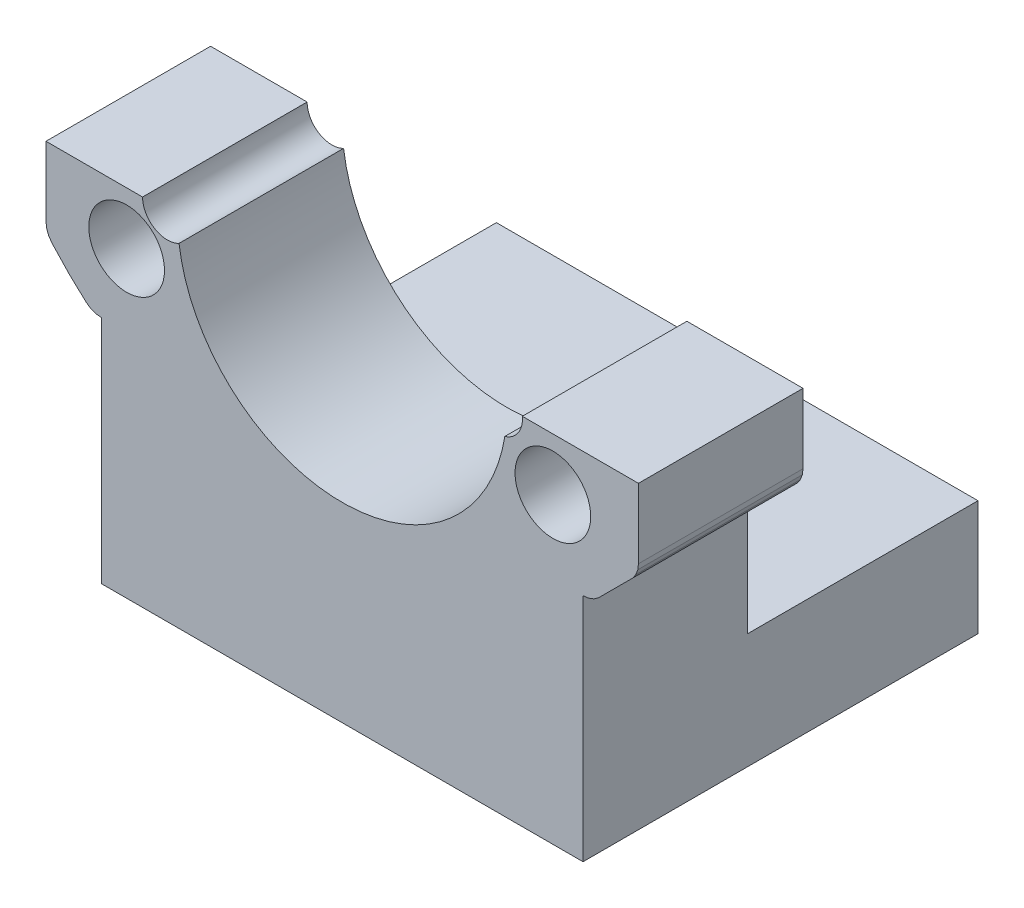
ISO-10303-21;
HEADER;
FILE_DESCRIPTION(('STEP AP214'),'2;1');
FILE_NAME('part.step','',(''),(''),'','','');
FILE_SCHEMA(('AUTOMOTIVE_DESIGN { 1 0 10303 214 1 1 1 1 }'));
ENDSEC;
DATA;
#1=APPLICATION_CONTEXT('core data for automotive mechanical design processes');
#2=APPLICATION_PROTOCOL_DEFINITION('international standard','automotive_design',2000,#1);
#3=PRODUCT_CONTEXT('',#1,'mechanical');
#4=PRODUCT('Part','Part','',(#3));
#5=PRODUCT_RELATED_PRODUCT_CATEGORY('part','',(#4));
#6=PRODUCT_DEFINITION_FORMATION('','',#4);
#7=PRODUCT_DEFINITION_CONTEXT('part definition',#1,'design');
#8=PRODUCT_DEFINITION('design','',#6,#7);
#9=PRODUCT_DEFINITION_SHAPE('','',#8);
#10=(LENGTH_UNIT() NAMED_UNIT(*) SI_UNIT(.MILLI.,.METRE.));
#11=(NAMED_UNIT(*) PLANE_ANGLE_UNIT() SI_UNIT($,.RADIAN.));
#12=(NAMED_UNIT(*) SI_UNIT($,.STERADIAN.) SOLID_ANGLE_UNIT());
#13=UNCERTAINTY_MEASURE_WITH_UNIT(LENGTH_MEASURE(1.E-05),#10,'distance_accuracy_value','');
#14=(GEOMETRIC_REPRESENTATION_CONTEXT(3) GLOBAL_UNCERTAINTY_ASSIGNED_CONTEXT((#13)) GLOBAL_UNIT_ASSIGNED_CONTEXT((#10,
#11,#12)) REPRESENTATION_CONTEXT('',''));
#15=CARTESIAN_POINT('',(0.,0.,0.));
#16=DIRECTION('',(0.,0.,1.));
#17=DIRECTION('',(1.,0.,0.));
#18=AXIS2_PLACEMENT_3D('',#15,#16,#17);
#19=CARTESIAN_POINT('',(189.181704305664,131.452042433818,-7.));
#20=DIRECTION('',(0.,-1.,0.));
#21=DIRECTION('',(0.,0.,-1.));
#22=AXIS2_PLACEMENT_3D('',#19,#20,#21);
#23=PLANE('',#22);
#24=DIRECTION('',(1.,0.,0.));
#25=VECTOR('',#24,1.);
#26=CARTESIAN_POINT('',(0.,131.452042433818,0.));
#27=LINE('',#26,#25);
#28=CARTESIAN_POINT('',(203.67064100923,131.452042433818,0.));
#29=VERTEX_POINT('',#28);
#30=CARTESIAN_POINT('',(207.199131389128,131.452042433818,0.));
#31=VERTEX_POINT('',#30);
#32=EDGE_CURVE('E239',#29,#31,#27,.T.);
#33=ORIENTED_EDGE('',*,*,#32,.F.);
#34=DIRECTION('',(0.,0.,1.));
#35=VECTOR('',#34,1.);
#36=CARTESIAN_POINT('',(203.67064100923,131.452042433818,-7.));
#37=LINE('',#36,#35);
#38=CARTESIAN_POINT('',(203.67064100923,131.452042433818,5.));
#39=VERTEX_POINT('',#38);
#40=EDGE_CURVE('E227',#29,#39,#37,.T.);
#41=ORIENTED_EDGE('',*,*,#40,.T.);
#42=DIRECTION('',(1.,0.,0.));
#43=VECTOR('',#42,1.);
#44=CARTESIAN_POINT('',(189.181704305664,131.452042433818,5.));
#45=LINE('',#44,#43);
#46=CARTESIAN_POINT('',(207.199131389128,131.452042433818,5.));
#47=VERTEX_POINT('',#46);
#48=EDGE_CURVE('E237',#39,#47,#45,.T.);
#49=ORIENTED_EDGE('',*,*,#48,.T.);
#50=DIRECTION('',(0.,0.,1.));
#51=VECTOR('',#50,1.);
#52=CARTESIAN_POINT('',(207.199131389128,131.452042433818,5.));
#53=LINE('',#52,#51);
#54=EDGE_CURVE('E268',#31,#47,#53,.T.);
#55=ORIENTED_EDGE('',*,*,#54,.F.);
#56=EDGE_LOOP('',(#33,#41,#49,#55));
#57=FACE_BOUND('',#56,.T.);
#58=ADVANCED_FACE('F47',(#57),#23,.F.);
#59=CARTESIAN_POINT('',(0.,0.,0.));
#60=DIRECTION('',(0.,0.,1.));
#61=DIRECTION('',(1.,0.,0.));
#62=AXIS2_PLACEMENT_3D('',#59,#60,#61);
#63=PLANE('',#62);
#64=CARTESIAN_POINT('',(191.649131389124,129.852042433818,0.));
#65=DIRECTION('',(0.,0.,1.));
#66=DIRECTION('',(1.,0.,0.));
#67=AXIS2_PLACEMENT_3D('',#64,#65,#66);
#68=CIRCLE('',#67,1.15000000000002);
#69=CARTESIAN_POINT('',(192.799131389124,129.852042433818,0.));
#70=VERTEX_POINT('',#69);
#71=EDGE_CURVE('E297',#70,#70,#68,.F.);
#72=ORIENTED_EDGE('',*,*,#71,.F.);
#73=EDGE_LOOP('',(#72));
#74=FACE_BOUND('',#73,.T.);
#75=CARTESIAN_POINT('',(204.599131389128,129.852042433818,0.));
#76=DIRECTION('',(0.,0.,1.));
#77=DIRECTION('',(1.,0.,0.));
#78=AXIS2_PLACEMENT_3D('',#75,#76,#77);
#79=CIRCLE('',#78,1.15000000000002);
#80=CARTESIAN_POINT('',(205.749131389128,129.852042433818,0.));
#81=VERTEX_POINT('',#80);
#82=EDGE_CURVE('E290',#81,#81,#79,.F.);
#83=ORIENTED_EDGE('',*,*,#82,.F.);
#84=EDGE_LOOP('',(#83));
#85=FACE_BOUND('',#84,.T.);
#86=CARTESIAN_POINT('',(189.199131389124,131.452042433818,0.));
#87=VERTEX_POINT('',#86);
#88=CARTESIAN_POINT('',(192.13252022332,131.452042433818,0.));
#89=VERTEX_POINT('',#88);
#90=EDGE_CURVE('E264',#87,#89,#27,.T.);
#91=ORIENTED_EDGE('',*,*,#90,.T.);
#92=CARTESIAN_POINT('',(192.886918709777,131.452042433818,0.));
#93=DIRECTION('',(0.,0.,1.));
#94=DIRECTION('',(1.,0.,0.));
#95=AXIS2_PLACEMENT_3D('',#92,#93,#94);
#96=CIRCLE('',#95,0.754398486457727);
#97=CARTESIAN_POINT('',(193.240054142263,130.785399768897,0.));
#98=VERTEX_POINT('',#97);
#99=EDGE_CURVE('E241',#89,#98,#96,.T.);
#100=ORIENTED_EDGE('',*,*,#99,.T.);
#101=CARTESIAN_POINT('',(198.199131389126,131.452042433818,0.));
#102=DIRECTION('',(0.,0.,1.));
#103=DIRECTION('',(1.,0.,0.));
#104=AXIS2_PLACEMENT_3D('',#101,#102,#103);
#105=CIRCLE('',#104,5.00368460067638);
#106=CARTESIAN_POINT('',(203.138984521825,130.655355161161,0.));
#107=VERTEX_POINT('',#106);
#108=EDGE_CURVE('E250',#98,#107,#105,.T.);
#109=ORIENTED_EDGE('',*,*,#108,.T.);
#110=CARTESIAN_POINT('',(202.919958347688,131.377258625214,0.));
#111=DIRECTION('',(0.,0.,1.));
#112=DIRECTION('',(1.,0.,0.));
#113=AXIS2_PLACEMENT_3D('',#110,#111,#112);
#114=CIRCLE('',#113,0.754398486457727);
#115=EDGE_CURVE('E70',#107,#29,#114,.T.);
#116=ORIENTED_EDGE('',*,*,#115,.T.);
#117=ORIENTED_EDGE('',*,*,#32,.T.);
#118=DIRECTION('',(3.00222328963253E-13,1.,0.));
#119=VECTOR('',#118,1.);
#120=CARTESIAN_POINT('',(207.199131389128,129.336090234141,0.));
#121=LINE('',#120,#119);
#122=CARTESIAN_POINT('',(207.199131389128,129.336090234141,0.));
#123=VERTEX_POINT('',#122);
#124=EDGE_CURVE('E422',#123,#31,#121,.T.);
#125=ORIENTED_EDGE('',*,*,#124,.F.);
#126=DIRECTION('',(0.120014541512522,0.992772133888507,0.));
#127=VECTOR('',#126,1.);
#128=CARTESIAN_POINT('',(207.178853849887,129.168352427967,0.));
#129=LINE('',#128,#127);
#130=CARTESIAN_POINT('',(207.178853849887,129.168352427967,0.));
#131=VERTEX_POINT('',#130);
#132=EDGE_CURVE('E419',#131,#123,#129,.T.);
#133=ORIENTED_EDGE('',*,*,#132,.F.);
#134=DIRECTION('',(0.354082694955069,0.935214117265857,0.));
#135=VECTOR('',#134,1.);
#136=CARTESIAN_POINT('',(207.118523910867,129.009007135276,0.));
#137=LINE('',#136,#135);
#138=CARTESIAN_POINT('',(207.118523910867,129.009007135276,0.));
#139=VERTEX_POINT('',#138);
#140=EDGE_CURVE('E416',#139,#131,#137,.T.);
#141=ORIENTED_EDGE('',*,*,#140,.F.);
#142=DIRECTION('',(0.567112335313196,0.823640455013966,0.));
#143=VECTOR('',#142,1.);
#144=CARTESIAN_POINT('',(207.023153735494,128.870497126327,0.));
#145=LINE('',#144,#143);
#146=CARTESIAN_POINT('',(207.023153735494,128.870497126327,0.));
#147=VERTEX_POINT('',#146);
#148=EDGE_CURVE('E413',#147,#139,#145,.T.);
#149=ORIENTED_EDGE('',*,*,#148,.F.);
#150=DIRECTION('',(0.707106781186924,0.707106781186171,0.));
#151=VECTOR('',#150,1.);
#152=CARTESIAN_POINT('',(205.981187619715,127.828531010549,0.));
#153=LINE('',#152,#151);
#154=CARTESIAN_POINT('',(205.981187619715,127.828531010549,0.));
#155=VERTEX_POINT('',#154);
#156=EDGE_CURVE('E410',#155,#147,#153,.T.);
#157=ORIENTED_EDGE('',*,*,#156,.F.);
#158=DIRECTION('',(0.824820147367993,0.565395193201925,0.));
#159=VECTOR('',#158,1.);
#160=CARTESIAN_POINT('',(205.840077690175,127.731803407411,0.));
#161=LINE('',#160,#159);
#162=CARTESIAN_POINT('',(205.840077690175,127.731803407411,0.));
#163=VERTEX_POINT('',#162);
#164=EDGE_CURVE('E407',#163,#155,#161,.T.);
#165=ORIENTED_EDGE('',*,*,#164,.F.);
#166=DIRECTION('',(0.935949757346233,0.352133570855618,0.));
#167=VECTOR('',#166,1.);
#168=CARTESIAN_POINT('',(205.683332318072,127.672830896162,0.));
#169=LINE('',#168,#167);
#170=CARTESIAN_POINT('',(205.683332318072,127.672830896162,0.));
#171=VERTEX_POINT('',#170);
#172=EDGE_CURVE('E404',#171,#163,#169,.T.);
#173=ORIENTED_EDGE('',*,*,#172,.F.);
#174=DIRECTION('',(0.992772133887948,0.120014541517141,0.));
#175=VECTOR('',#174,1.);
#176=CARTESIAN_POINT('',(205.515594511901,127.652553356921,0.));
#177=LINE('',#176,#175);
#178=CARTESIAN_POINT('',(205.515594511901,127.652553356921,0.));
#179=VERTEX_POINT('',#178);
#180=EDGE_CURVE('E401',#179,#171,#177,.T.);
#181=ORIENTED_EDGE('',*,*,#180,.F.);
#182=DIRECTION('',(0.,-1.,0.));
#183=VECTOR('',#182,1.);
#184=CARTESIAN_POINT('',(205.515594511901,127.652553356921,0.));
#185=LINE('',#184,#183);
#186=CARTESIAN_POINT('',(205.515594511901,124.152553356921,0.));
#187=VERTEX_POINT('',#186);
#188=EDGE_CURVE('E272',#179,#187,#185,.T.);
#189=ORIENTED_EDGE('',*,*,#188,.T.);
#190=DIRECTION('',(-1.,0.,0.));
#191=VECTOR('',#190,1.);
#192=CARTESIAN_POINT('',(205.515594511901,124.152553356921,0.));
#193=LINE('',#192,#191);
#194=CARTESIAN_POINT('',(190.882668266347,124.152553356921,0.));
#195=VERTEX_POINT('',#194);
#196=EDGE_CURVE('E276',#187,#195,#193,.T.);
#197=ORIENTED_EDGE('',*,*,#196,.T.);
#198=DIRECTION('',(0.,1.,0.));
#199=VECTOR('',#198,1.);
#200=CARTESIAN_POINT('',(190.882668266347,124.152553356921,0.));
#201=LINE('',#200,#199);
#202=CARTESIAN_POINT('',(190.882668266347,127.652553356921,0.));
#203=VERTEX_POINT('',#202);
#204=EDGE_CURVE('E280',#195,#203,#201,.T.);
#205=ORIENTED_EDGE('',*,*,#204,.T.);
#206=DIRECTION('',(0.992842474265272,-0.119431240866082,0.));
#207=VECTOR('',#206,1.);
#208=CARTESIAN_POINT('',(190.715733880934,127.672634267347,0.));
#209=LINE('',#208,#207);
#210=CARTESIAN_POINT('',(190.715733880934,127.672634267347,0.));
#211=VERTEX_POINT('',#210);
#212=EDGE_CURVE('E397',#211,#203,#209,.T.);
#213=ORIENTED_EDGE('',*,*,#212,.F.);
#214=DIRECTION('',(0.936156483608514,-0.351583614802712,0.));
#215=VECTOR('',#214,1.);
#216=CARTESIAN_POINT('',(190.558185088073,127.731803407412,0.));
#217=LINE('',#216,#215);
#218=CARTESIAN_POINT('',(190.558185088073,127.731803407412,0.));
#219=VERTEX_POINT('',#218);
#220=EDGE_CURVE('E394',#219,#211,#217,.T.);
#221=ORIENTED_EDGE('',*,*,#220,.F.);
#222=DIRECTION('',(0.824820147362994,-0.565395193209218,0.));
#223=VECTOR('',#222,1.);
#224=CARTESIAN_POINT('',(190.417075158534,127.828531010552,0.));
#225=LINE('',#224,#223);
#226=CARTESIAN_POINT('',(190.417075158534,127.828531010552,0.));
#227=VERTEX_POINT('',#226);
#228=EDGE_CURVE('E337',#227,#219,#225,.T.);
#229=ORIENTED_EDGE('',*,*,#228,.F.);
#230=DIRECTION('',(0.728911144290955,-0.68460831409533,0.));
#231=VECTOR('',#230,1.);
#232=CARTESIAN_POINT('',(189.879763337845,128.333185305642,0.));
#233=LINE('',#232,#231);
#234=CARTESIAN_POINT('',(189.879763337845,128.333185305642,0.));
#235=VERTEX_POINT('',#234);
#236=EDGE_CURVE('E343',#235,#227,#233,.T.);
#237=ORIENTED_EDGE('',*,*,#236,.F.);
#238=DIRECTION('',(0.684608314095311,-0.728911144290973,0.));
#239=VECTOR('',#238,1.);
#240=CARTESIAN_POINT('',(189.375109042755,128.870497126331,0.));
#241=LINE('',#240,#239);
#242=CARTESIAN_POINT('',(189.375109042755,128.870497126331,0.));
#243=VERTEX_POINT('',#242);
#244=EDGE_CURVE('E438',#243,#235,#241,.T.);
#245=ORIENTED_EDGE('',*,*,#244,.F.);
#246=DIRECTION('',(0.563148962738582,-0.826355399187576,0.));
#247=VECTOR('',#246,1.);
#248=CARTESIAN_POINT('',(189.276625012494,129.015010950425,0.));
#249=LINE('',#248,#247);
#250=CARTESIAN_POINT('',(189.276625012494,129.015010950425,0.));
#251=VERTEX_POINT('',#250);
#252=EDGE_CURVE('E435',#251,#243,#249,.T.);
#253=ORIENTED_EDGE('',*,*,#252,.F.);
#254=DIRECTION('',(0.349585772718913,-0.936904364122892,0.));
#255=VECTOR('',#254,1.);
#256=CARTESIAN_POINT('',(189.219408928365,129.168352427972,0.));
#257=LINE('',#256,#255);
#258=CARTESIAN_POINT('',(189.219408928365,129.168352427972,0.));
#259=VERTEX_POINT('',#258);
#260=EDGE_CURVE('E432',#259,#251,#257,.T.);
#261=ORIENTED_EDGE('',*,*,#260,.F.);
#262=DIRECTION('',(0.120014541516616,-0.992772133888012,0.));
#263=VECTOR('',#262,1.);
#264=CARTESIAN_POINT('',(189.199131389124,129.336090234144,0.));
#265=LINE('',#264,#263);
#266=CARTESIAN_POINT('',(189.199131389124,129.336090234144,0.));
#267=VERTEX_POINT('',#266);
#268=EDGE_CURVE('E429',#267,#259,#265,.T.);
#269=ORIENTED_EDGE('',*,*,#268,.F.);
#270=DIRECTION('',(0.,-1.,0.));
#271=VECTOR('',#270,1.);
#272=CARTESIAN_POINT('',(189.199131389124,132.202042433818,0.));
#273=LINE('',#272,#271);
#274=EDGE_CURVE('E426',#87,#267,#273,.T.);
#275=ORIENTED_EDGE('',*,*,#274,.F.);
#276=EDGE_LOOP('',(#91,#100,#109,#116,#117,#125,#133,#141,#149,#157,#165,#173,#181,#189,#197,
#205,#213,#221,#229,#237,#245,#253,#261,#269,#275));
#277=FACE_BOUND('',#276,.T.);
#278=ADVANCED_FACE('F515',(#74,#85,#277),#63,.F.);
#279=CARTESIAN_POINT('',(190.417075158534,127.828531010552,5.));
#280=DIRECTION('',(0.565395193209218,0.824820147362994,0.));
#281=DIRECTION('',(-0.824820147362994,0.565395193209218,0.));
#282=AXIS2_PLACEMENT_3D('',#279,#280,#281);
#283=PLANE('',#282);
#284=ORIENTED_EDGE('',*,*,#228,.T.);
#285=DIRECTION('',(0.,0.,-1.));
#286=VECTOR('',#285,1.);
#287=CARTESIAN_POINT('',(190.558185088073,127.731803407412,5.));
#288=LINE('',#287,#286);
#289=CARTESIAN_POINT('',(190.558185088073,127.731803407412,5.));
#290=VERTEX_POINT('',#289);
#291=EDGE_CURVE('E506',#290,#219,#288,.T.);
#292=ORIENTED_EDGE('',*,*,#291,.F.);
#293=DIRECTION('',(0.824820147362994,-0.565395193209218,0.));
#294=VECTOR('',#293,1.);
#295=CARTESIAN_POINT('',(190.417075158534,127.828531010552,5.));
#296=LINE('',#295,#294);
#297=CARTESIAN_POINT('',(190.417075158534,127.828531010552,5.));
#298=VERTEX_POINT('',#297);
#299=EDGE_CURVE('E338',#298,#290,#296,.T.);
#300=ORIENTED_EDGE('',*,*,#299,.F.);
#301=DIRECTION('',(0.,0.,-1.));
#302=VECTOR('',#301,1.);
#303=CARTESIAN_POINT('',(190.417075158534,127.828531010552,5.));
#304=LINE('',#303,#302);
#305=EDGE_CURVE('E390',#298,#227,#304,.T.);
#306=ORIENTED_EDGE('',*,*,#305,.T.);
#307=EDGE_LOOP('',(#284,#292,#300,#306));
#308=FACE_BOUND('',#307,.T.);
#309=ADVANCED_FACE('F49',(#308),#283,.F.);
#310=CARTESIAN_POINT('',(190.558185088073,127.731803407412,5.));
#311=DIRECTION('',(0.351583614802712,0.936156483608514,0.));
#312=DIRECTION('',(-0.936156483608514,0.351583614802712,0.));
#313=AXIS2_PLACEMENT_3D('',#310,#311,#312);
#314=PLANE('',#313);
#315=ORIENTED_EDGE('',*,*,#220,.T.);
#316=DIRECTION('',(0.,0.,-1.));
#317=VECTOR('',#316,1.);
#318=CARTESIAN_POINT('',(190.715733880934,127.672634267347,5.));
#319=LINE('',#318,#317);
#320=CARTESIAN_POINT('',(190.715733880934,127.672634267347,5.));
#321=VERTEX_POINT('',#320);
#322=EDGE_CURVE('E502',#321,#211,#319,.T.);
#323=ORIENTED_EDGE('',*,*,#322,.F.);
#324=DIRECTION('',(0.936156483608514,-0.351583614802712,0.));
#325=VECTOR('',#324,1.);
#326=CARTESIAN_POINT('',(190.558185088073,127.731803407412,5.));
#327=LINE('',#326,#325);
#328=EDGE_CURVE('E342',#290,#321,#327,.T.);
#329=ORIENTED_EDGE('',*,*,#328,.F.);
#330=ORIENTED_EDGE('',*,*,#291,.T.);
#331=EDGE_LOOP('',(#315,#323,#329,#330));
#332=FACE_BOUND('',#331,.T.);
#333=ADVANCED_FACE('F566',(#332),#314,.F.);
#334=CARTESIAN_POINT('',(190.715733880934,127.672634267347,5.));
#335=DIRECTION('',(0.119431240866082,0.992842474265272,0.));
#336=DIRECTION('',(-0.992842474265272,0.119431240866082,0.));
#337=AXIS2_PLACEMENT_3D('',#334,#335,#336);
#338=PLANE('',#337);
#339=ORIENTED_EDGE('',*,*,#212,.T.);
#340=DIRECTION('',(0.,0.,-1.));
#341=VECTOR('',#340,1.);
#342=CARTESIAN_POINT('',(190.882668266347,127.652553356921,5.));
#343=LINE('',#342,#341);
#344=CARTESIAN_POINT('',(190.882668266347,127.652553356921,5.));
#345=VERTEX_POINT('',#344);
#346=EDGE_CURVE('E498',#345,#203,#343,.T.);
#347=ORIENTED_EDGE('',*,*,#346,.F.);
#348=DIRECTION('',(0.992842474265272,-0.119431240866082,0.));
#349=VECTOR('',#348,1.);
#350=CARTESIAN_POINT('',(190.715733880934,127.672634267347,5.));
#351=LINE('',#350,#349);
#352=EDGE_CURVE('E346',#321,#345,#351,.T.);
#353=ORIENTED_EDGE('',*,*,#352,.F.);
#354=ORIENTED_EDGE('',*,*,#322,.T.);
#355=EDGE_LOOP('',(#339,#347,#353,#354));
#356=FACE_BOUND('',#355,.T.);
#357=ADVANCED_FACE('F573',(#356),#338,.F.);
#358=CARTESIAN_POINT('',(205.515594511901,127.652553356921,5.));
#359=DIRECTION('',(-0.120014541517141,0.992772133887948,0.));
#360=DIRECTION('',(-0.992772133887948,-0.120014541517141,0.));
#361=AXIS2_PLACEMENT_3D('',#358,#359,#360);
#362=PLANE('',#361);
#363=ORIENTED_EDGE('',*,*,#180,.T.);
#364=DIRECTION('',(0.,0.,-1.));
#365=VECTOR('',#364,1.);
#366=CARTESIAN_POINT('',(205.683332318072,127.672830896162,5.));
#367=LINE('',#366,#365);
#368=CARTESIAN_POINT('',(205.683332318072,127.672830896162,5.));
#369=VERTEX_POINT('',#368);
#370=EDGE_CURVE('E490',#369,#171,#367,.T.);
#371=ORIENTED_EDGE('',*,*,#370,.F.);
#372=DIRECTION('',(0.992772133887948,0.120014541517141,0.));
#373=VECTOR('',#372,1.);
#374=CARTESIAN_POINT('',(205.515594511901,127.652553356921,5.));
#375=LINE('',#374,#373);
#376=CARTESIAN_POINT('',(205.515594511901,127.652553356921,5.));
#377=VERTEX_POINT('',#376);
#378=EDGE_CURVE('E349',#377,#369,#375,.T.);
#379=ORIENTED_EDGE('',*,*,#378,.F.);
#380=DIRECTION('',(0.,0.,-1.));
#381=VECTOR('',#380,1.);
#382=CARTESIAN_POINT('',(205.515594511901,127.652553356921,5.));
#383=LINE('',#382,#381);
#384=EDGE_CURVE('E494',#377,#179,#383,.T.);
#385=ORIENTED_EDGE('',*,*,#384,.T.);
#386=EDGE_LOOP('',(#363,#371,#379,#385));
#387=FACE_BOUND('',#386,.T.);
#388=ADVANCED_FACE('F596',(#387),#362,.F.);
#389=CARTESIAN_POINT('',(205.683332318072,127.672830896162,5.));
#390=DIRECTION('',(-0.352133570855618,0.935949757346233,0.));
#391=DIRECTION('',(-0.935949757346233,-0.352133570855618,0.));
#392=AXIS2_PLACEMENT_3D('',#389,#390,#391);
#393=PLANE('',#392);
#394=ORIENTED_EDGE('',*,*,#172,.T.);
#395=DIRECTION('',(0.,0.,-1.));
#396=VECTOR('',#395,1.);
#397=CARTESIAN_POINT('',(205.840077690175,127.731803407411,5.));
#398=LINE('',#397,#396);
#399=CARTESIAN_POINT('',(205.840077690175,127.731803407411,5.));
#400=VERTEX_POINT('',#399);
#401=EDGE_CURVE('E486',#400,#163,#398,.T.);
#402=ORIENTED_EDGE('',*,*,#401,.F.);
#403=DIRECTION('',(0.935949757346233,0.352133570855618,0.));
#404=VECTOR('',#403,1.);
#405=CARTESIAN_POINT('',(205.683332318072,127.672830896162,5.));
#406=LINE('',#405,#404);
#407=EDGE_CURVE('E352',#369,#400,#406,.T.);
#408=ORIENTED_EDGE('',*,*,#407,.F.);
#409=ORIENTED_EDGE('',*,*,#370,.T.);
#410=EDGE_LOOP('',(#394,#402,#408,#409));
#411=FACE_BOUND('',#410,.T.);
#412=ADVANCED_FACE('F600',(#411),#393,.F.);
#413=CARTESIAN_POINT('',(205.840077690175,127.731803407411,5.));
#414=DIRECTION('',(-0.565395193201925,0.824820147367993,0.));
#415=DIRECTION('',(-0.824820147367993,-0.565395193201925,0.));
#416=AXIS2_PLACEMENT_3D('',#413,#414,#415);
#417=PLANE('',#416);
#418=ORIENTED_EDGE('',*,*,#164,.T.);
#419=DIRECTION('',(0.,0.,-1.));
#420=VECTOR('',#419,1.);
#421=CARTESIAN_POINT('',(205.981187619715,127.828531010549,5.));
#422=LINE('',#421,#420);
#423=CARTESIAN_POINT('',(205.981187619715,127.828531010549,5.));
#424=VERTEX_POINT('',#423);
#425=EDGE_CURVE('E482',#424,#155,#422,.T.);
#426=ORIENTED_EDGE('',*,*,#425,.F.);
#427=DIRECTION('',(0.824820147367993,0.565395193201925,0.));
#428=VECTOR('',#427,1.);
#429=CARTESIAN_POINT('',(205.840077690175,127.731803407411,5.));
#430=LINE('',#429,#428);
#431=EDGE_CURVE('E355',#400,#424,#430,.T.);
#432=ORIENTED_EDGE('',*,*,#431,.F.);
#433=ORIENTED_EDGE('',*,*,#401,.T.);
#434=EDGE_LOOP('',(#418,#426,#432,#433));
#435=FACE_BOUND('',#434,.T.);
#436=ADVANCED_FACE('F605',(#435),#417,.F.);
#437=CARTESIAN_POINT('',(205.981187619715,127.828531010549,5.));
#438=DIRECTION('',(-0.707106781186171,0.707106781186924,0.));
#439=DIRECTION('',(-0.707106781186924,-0.707106781186171,0.));
#440=AXIS2_PLACEMENT_3D('',#437,#438,#439);
#441=PLANE('',#440);
#442=ORIENTED_EDGE('',*,*,#156,.T.);
#443=DIRECTION('',(0.,0.,-1.));
#444=VECTOR('',#443,1.);
#445=CARTESIAN_POINT('',(207.023153735494,128.870497126327,5.));
#446=LINE('',#445,#444);
#447=CARTESIAN_POINT('',(207.023153735494,128.870497126327,5.));
#448=VERTEX_POINT('',#447);
#449=EDGE_CURVE('E478',#448,#147,#446,.T.);
#450=ORIENTED_EDGE('',*,*,#449,.F.);
#451=DIRECTION('',(0.707106781186924,0.707106781186171,0.));
#452=VECTOR('',#451,1.);
#453=CARTESIAN_POINT('',(205.981187619715,127.828531010549,5.));
#454=LINE('',#453,#452);
#455=EDGE_CURVE('E358',#424,#448,#454,.T.);
#456=ORIENTED_EDGE('',*,*,#455,.F.);
#457=ORIENTED_EDGE('',*,*,#425,.T.);
#458=EDGE_LOOP('',(#442,#450,#456,#457));
#459=FACE_BOUND('',#458,.T.);
#460=ADVANCED_FACE('F611',(#459),#441,.F.);
#461=CARTESIAN_POINT('',(207.023153735494,128.870497126327,5.));
#462=DIRECTION('',(-0.823640455013966,0.567112335313196,0.));
#463=DIRECTION('',(-0.567112335313196,-0.823640455013966,0.));
#464=AXIS2_PLACEMENT_3D('',#461,#462,#463);
#465=PLANE('',#464);
#466=ORIENTED_EDGE('',*,*,#148,.T.);
#467=DIRECTION('',(0.,0.,-1.));
#468=VECTOR('',#467,1.);
#469=CARTESIAN_POINT('',(207.118523910867,129.009007135276,5.));
#470=LINE('',#469,#468);
#471=CARTESIAN_POINT('',(207.118523910867,129.009007135276,5.));
#472=VERTEX_POINT('',#471);
#473=EDGE_CURVE('E474',#472,#139,#470,.T.);
#474=ORIENTED_EDGE('',*,*,#473,.F.);
#475=DIRECTION('',(0.567112335313196,0.823640455013966,0.));
#476=VECTOR('',#475,1.);
#477=CARTESIAN_POINT('',(207.023153735494,128.870497126327,5.));
#478=LINE('',#477,#476);
#479=EDGE_CURVE('E361',#448,#472,#478,.T.);
#480=ORIENTED_EDGE('',*,*,#479,.F.);
#481=ORIENTED_EDGE('',*,*,#449,.T.);
#482=EDGE_LOOP('',(#466,#474,#480,#481));
#483=FACE_BOUND('',#482,.T.);
#484=ADVANCED_FACE('F615',(#483),#465,.F.);
#485=CARTESIAN_POINT('',(207.118523910867,129.009007135276,5.));
#486=DIRECTION('',(-0.935214117265857,0.354082694955069,0.));
#487=DIRECTION('',(-0.354082694955069,-0.935214117265857,0.));
#488=AXIS2_PLACEMENT_3D('',#485,#486,#487);
#489=PLANE('',#488);
#490=ORIENTED_EDGE('',*,*,#140,.T.);
#491=DIRECTION('',(0.,0.,-1.));
#492=VECTOR('',#491,1.);
#493=CARTESIAN_POINT('',(207.178853849887,129.168352427967,5.));
#494=LINE('',#493,#492);
#495=CARTESIAN_POINT('',(207.178853849887,129.168352427967,5.));
#496=VERTEX_POINT('',#495);
#497=EDGE_CURVE('E470',#496,#131,#494,.T.);
#498=ORIENTED_EDGE('',*,*,#497,.F.);
#499=DIRECTION('',(0.354082694955069,0.935214117265857,0.));
#500=VECTOR('',#499,1.);
#501=CARTESIAN_POINT('',(207.118523910867,129.009007135276,5.));
#502=LINE('',#501,#500);
#503=EDGE_CURVE('E364',#472,#496,#502,.T.);
#504=ORIENTED_EDGE('',*,*,#503,.F.);
#505=ORIENTED_EDGE('',*,*,#473,.T.);
#506=EDGE_LOOP('',(#490,#498,#504,#505));
#507=FACE_BOUND('',#506,.T.);
#508=ADVANCED_FACE('F620',(#507),#489,.F.);
#509=CARTESIAN_POINT('',(207.178853849887,129.168352427967,5.));
#510=DIRECTION('',(-0.992772133888507,0.120014541512522,0.));
#511=DIRECTION('',(-0.120014541512522,-0.992772133888507,0.));
#512=AXIS2_PLACEMENT_3D('',#509,#510,#511);
#513=PLANE('',#512);
#514=ORIENTED_EDGE('',*,*,#132,.T.);
#515=DIRECTION('',(0.,0.,-1.));
#516=VECTOR('',#515,1.);
#517=CARTESIAN_POINT('',(207.199131389128,129.336090234141,5.));
#518=LINE('',#517,#516);
#519=CARTESIAN_POINT('',(207.199131389128,129.336090234141,5.));
#520=VERTEX_POINT('',#519);
#521=EDGE_CURVE('E466',#520,#123,#518,.T.);
#522=ORIENTED_EDGE('',*,*,#521,.F.);
#523=DIRECTION('',(0.120014541512522,0.992772133888507,0.));
#524=VECTOR('',#523,1.);
#525=CARTESIAN_POINT('',(207.178853849887,129.168352427967,5.));
#526=LINE('',#525,#524);
#527=EDGE_CURVE('E367',#496,#520,#526,.T.);
#528=ORIENTED_EDGE('',*,*,#527,.F.);
#529=ORIENTED_EDGE('',*,*,#497,.T.);
#530=EDGE_LOOP('',(#514,#522,#528,#529));
#531=FACE_BOUND('',#530,.T.);
#532=ADVANCED_FACE('F624',(#531),#513,.F.);
#533=CARTESIAN_POINT('',(207.199131389128,129.336090234141,5.));
#534=DIRECTION('',(-1.,3.00222328963253E-13,0.));
#535=DIRECTION('',(-3.00222328963253E-13,-1.,0.));
#536=AXIS2_PLACEMENT_3D('',#533,#534,#535);
#537=PLANE('',#536);
#538=ORIENTED_EDGE('',*,*,#124,.T.);
#539=ORIENTED_EDGE('',*,*,#54,.T.);
#540=DIRECTION('',(3.00222328963253E-13,1.,0.));
#541=VECTOR('',#540,1.);
#542=CARTESIAN_POINT('',(207.199131389128,129.336090234141,5.));
#543=LINE('',#542,#541);
#544=EDGE_CURVE('E247',#520,#47,#543,.T.);
#545=ORIENTED_EDGE('',*,*,#544,.F.);
#546=ORIENTED_EDGE('',*,*,#521,.T.);
#547=EDGE_LOOP('',(#538,#539,#545,#546));
#548=FACE_BOUND('',#547,.T.);
#549=ADVANCED_FACE('F628',(#548),#537,.F.);
#550=CARTESIAN_POINT('',(189.199131389124,132.202042433818,5.));
#551=DIRECTION('',(1.,0.,0.));
#552=DIRECTION('',(0.,1.,0.));
#553=AXIS2_PLACEMENT_3D('',#550,#551,#552);
#554=PLANE('',#553);
#555=DIRECTION('',(0.,-1.,0.));
#556=VECTOR('',#555,1.);
#557=CARTESIAN_POINT('',(189.199131389124,132.202042433818,5.));
#558=LINE('',#557,#556);
#559=CARTESIAN_POINT('',(189.199131389124,131.452042433818,5.));
#560=VERTEX_POINT('',#559);
#561=CARTESIAN_POINT('',(189.199131389124,129.336090234144,5.));
#562=VERTEX_POINT('',#561);
#563=EDGE_CURVE('E372',#560,#562,#558,.T.);
#564=ORIENTED_EDGE('',*,*,#563,.F.);
#565=DIRECTION('',(0.,0.,-1.));
#566=VECTOR('',#565,1.);
#567=CARTESIAN_POINT('',(189.199131389124,131.452042433818,5.));
#568=LINE('',#567,#566);
#569=EDGE_CURVE('E255',#560,#87,#568,.T.);
#570=ORIENTED_EDGE('',*,*,#569,.T.);
#571=ORIENTED_EDGE('',*,*,#274,.T.);
#572=DIRECTION('',(0.,0.,-1.));
#573=VECTOR('',#572,1.);
#574=CARTESIAN_POINT('',(189.199131389124,129.336090234144,5.));
#575=LINE('',#574,#573);
#576=EDGE_CURVE('E462',#562,#267,#575,.T.);
#577=ORIENTED_EDGE('',*,*,#576,.F.);
#578=EDGE_LOOP('',(#564,#570,#571,#577));
#579=FACE_BOUND('',#578,.T.);
#580=ADVANCED_FACE('F535',(#579),#554,.F.);
#581=CARTESIAN_POINT('',(189.199131389124,129.336090234144,5.));
#582=DIRECTION('',(0.992772133888012,0.120014541516616,0.));
#583=DIRECTION('',(-0.120014541516616,0.992772133888012,0.));
#584=AXIS2_PLACEMENT_3D('',#581,#582,#583);
#585=PLANE('',#584);
#586=ORIENTED_EDGE('',*,*,#268,.T.);
#587=DIRECTION('',(0.,0.,-1.));
#588=VECTOR('',#587,1.);
#589=CARTESIAN_POINT('',(189.219408928365,129.168352427972,5.));
#590=LINE('',#589,#588);
#591=CARTESIAN_POINT('',(189.219408928365,129.168352427972,5.));
#592=VERTEX_POINT('',#591);
#593=EDGE_CURVE('E458',#592,#259,#590,.T.);
#594=ORIENTED_EDGE('',*,*,#593,.F.);
#595=DIRECTION('',(0.120014541516616,-0.992772133888012,0.));
#596=VECTOR('',#595,1.);
#597=CARTESIAN_POINT('',(189.199131389124,129.336090234144,5.));
#598=LINE('',#597,#596);
#599=EDGE_CURVE('E375',#562,#592,#598,.T.);
#600=ORIENTED_EDGE('',*,*,#599,.F.);
#601=ORIENTED_EDGE('',*,*,#576,.T.);
#602=EDGE_LOOP('',(#586,#594,#600,#601));
#603=FACE_BOUND('',#602,.T.);
#604=ADVANCED_FACE('F540',(#603),#585,.F.);
#605=CARTESIAN_POINT('',(189.219408928365,129.168352427972,5.));
#606=DIRECTION('',(0.936904364122892,0.349585772718913,0.));
#607=DIRECTION('',(-0.349585772718913,0.936904364122892,0.));
#608=AXIS2_PLACEMENT_3D('',#605,#606,#607);
#609=PLANE('',#608);
#610=ORIENTED_EDGE('',*,*,#260,.T.);
#611=DIRECTION('',(0.,0.,-1.));
#612=VECTOR('',#611,1.);
#613=CARTESIAN_POINT('',(189.276625012494,129.015010950425,5.));
#614=LINE('',#613,#612);
#615=CARTESIAN_POINT('',(189.276625012494,129.015010950425,5.));
#616=VERTEX_POINT('',#615);
#617=EDGE_CURVE('E454',#616,#251,#614,.T.);
#618=ORIENTED_EDGE('',*,*,#617,.F.);
#619=DIRECTION('',(0.349585772718913,-0.936904364122892,0.));
#620=VECTOR('',#619,1.);
#621=CARTESIAN_POINT('',(189.219408928365,129.168352427972,5.));
#622=LINE('',#621,#620);
#623=EDGE_CURVE('E378',#592,#616,#622,.T.);
#624=ORIENTED_EDGE('',*,*,#623,.F.);
#625=ORIENTED_EDGE('',*,*,#593,.T.);
#626=EDGE_LOOP('',(#610,#618,#624,#625));
#627=FACE_BOUND('',#626,.T.);
#628=ADVANCED_FACE('F546',(#627),#609,.F.);
#629=CARTESIAN_POINT('',(189.276625012494,129.015010950425,5.));
#630=DIRECTION('',(0.826355399187577,0.563148962738582,0.));
#631=DIRECTION('',(-0.563148962738582,0.826355399187577,0.));
#632=AXIS2_PLACEMENT_3D('',#629,#630,#631);
#633=PLANE('',#632);
#634=ORIENTED_EDGE('',*,*,#252,.T.);
#635=DIRECTION('',(0.,0.,-1.));
#636=VECTOR('',#635,1.);
#637=CARTESIAN_POINT('',(189.375109042755,128.870497126331,5.));
#638=LINE('',#637,#636);
#639=CARTESIAN_POINT('',(189.375109042755,128.870497126331,5.));
#640=VERTEX_POINT('',#639);
#641=EDGE_CURVE('E450',#640,#243,#638,.T.);
#642=ORIENTED_EDGE('',*,*,#641,.F.);
#643=DIRECTION('',(0.563148962738582,-0.826355399187576,0.));
#644=VECTOR('',#643,1.);
#645=CARTESIAN_POINT('',(189.276625012494,129.015010950425,5.));
#646=LINE('',#645,#644);
#647=EDGE_CURVE('E381',#616,#640,#646,.T.);
#648=ORIENTED_EDGE('',*,*,#647,.F.);
#649=ORIENTED_EDGE('',*,*,#617,.T.);
#650=EDGE_LOOP('',(#634,#642,#648,#649));
#651=FACE_BOUND('',#650,.T.);
#652=ADVANCED_FACE('F550',(#651),#633,.F.);
#653=CARTESIAN_POINT('',(189.375109042755,128.870497126331,5.));
#654=DIRECTION('',(0.728911144290973,0.684608314095311,0.));
#655=DIRECTION('',(-0.684608314095311,0.728911144290973,0.));
#656=AXIS2_PLACEMENT_3D('',#653,#654,#655);
#657=PLANE('',#656);
#658=ORIENTED_EDGE('',*,*,#244,.T.);
#659=DIRECTION('',(0.,0.,-1.));
#660=VECTOR('',#659,1.);
#661=CARTESIAN_POINT('',(189.879763337845,128.333185305642,5.));
#662=LINE('',#661,#660);
#663=CARTESIAN_POINT('',(189.879763337845,128.333185305642,5.));
#664=VERTEX_POINT('',#663);
#665=EDGE_CURVE('E446',#664,#235,#662,.T.);
#666=ORIENTED_EDGE('',*,*,#665,.F.);
#667=DIRECTION('',(0.684608314095311,-0.728911144290973,0.));
#668=VECTOR('',#667,1.);
#669=CARTESIAN_POINT('',(189.375109042755,128.870497126331,5.));
#670=LINE('',#669,#668);
#671=EDGE_CURVE('E384',#640,#664,#670,.T.);
#672=ORIENTED_EDGE('',*,*,#671,.F.);
#673=ORIENTED_EDGE('',*,*,#641,.T.);
#674=EDGE_LOOP('',(#658,#666,#672,#673));
#675=FACE_BOUND('',#674,.T.);
#676=ADVANCED_FACE('F555',(#675),#657,.F.);
#677=CARTESIAN_POINT('',(189.879763337845,128.333185305642,5.));
#678=DIRECTION('',(0.68460831409533,0.728911144290955,0.));
#679=DIRECTION('',(-0.728911144290955,0.68460831409533,0.));
#680=AXIS2_PLACEMENT_3D('',#677,#678,#679);
#681=PLANE('',#680);
#682=ORIENTED_EDGE('',*,*,#236,.T.);
#683=ORIENTED_EDGE('',*,*,#305,.F.);
#684=DIRECTION('',(0.728911144290955,-0.68460831409533,0.));
#685=VECTOR('',#684,1.);
#686=CARTESIAN_POINT('',(189.879763337845,128.333185305642,5.));
#687=LINE('',#686,#685);
#688=EDGE_CURVE('E387',#664,#298,#687,.T.);
#689=ORIENTED_EDGE('',*,*,#688,.F.);
#690=ORIENTED_EDGE('',*,*,#665,.T.);
#691=EDGE_LOOP('',(#682,#683,#689,#690));
#692=FACE_BOUND('',#691,.T.);
#693=ADVANCED_FACE('F561',(#692),#681,.F.);
#694=CARTESIAN_POINT('',(0.,0.,5.));
#695=DIRECTION('',(0.,0.,1.));
#696=DIRECTION('',(1.,0.,0.));
#697=AXIS2_PLACEMENT_3D('',#694,#695,#696);
#698=PLANE('',#697);
#699=CARTESIAN_POINT('',(192.886918709777,131.452042433818,5.));
#700=DIRECTION('',(0.,0.,1.));
#701=DIRECTION('',(1.,0.,0.));
#702=AXIS2_PLACEMENT_3D('',#699,#700,#701);
#703=CIRCLE('',#702,0.754398486457727);
#704=CARTESIAN_POINT('',(192.13252022332,131.452042433818,5.));
#705=VERTEX_POINT('',#704);
#706=CARTESIAN_POINT('',(193.240054142263,130.785399768897,5.));
#707=VERTEX_POINT('',#706);
#708=EDGE_CURVE('E63',#705,#707,#703,.T.);
#709=ORIENTED_EDGE('',*,*,#708,.F.);
#710=EDGE_CURVE('E249',#560,#705,#45,.T.);
#711=ORIENTED_EDGE('',*,*,#710,.F.);
#712=ORIENTED_EDGE('',*,*,#563,.T.);
#713=ORIENTED_EDGE('',*,*,#599,.T.);
#714=ORIENTED_EDGE('',*,*,#623,.T.);
#715=ORIENTED_EDGE('',*,*,#647,.T.);
#716=ORIENTED_EDGE('',*,*,#671,.T.);
#717=ORIENTED_EDGE('',*,*,#688,.T.);
#718=ORIENTED_EDGE('',*,*,#299,.T.);
#719=ORIENTED_EDGE('',*,*,#328,.T.);
#720=ORIENTED_EDGE('',*,*,#352,.T.);
#721=DIRECTION('',(0.,1.,0.));
#722=VECTOR('',#721,1.);
#723=CARTESIAN_POINT('',(190.882668266347,120.652553356921,5.));
#724=LINE('',#723,#722);
#725=CARTESIAN_POINT('',(190.882668266347,120.652553356921,5.));
#726=VERTEX_POINT('',#725);
#727=EDGE_CURVE('E329',#726,#345,#724,.T.);
#728=ORIENTED_EDGE('',*,*,#727,.F.);
#729=DIRECTION('',(-1.,0.,0.));
#730=VECTOR('',#729,1.);
#731=CARTESIAN_POINT('',(205.515594511901,120.652553356921,5.));
#732=LINE('',#731,#730);
#733=CARTESIAN_POINT('',(205.515594511901,120.652553356921,5.));
#734=VERTEX_POINT('',#733);
#735=EDGE_CURVE('E323',#734,#726,#732,.T.);
#736=ORIENTED_EDGE('',*,*,#735,.F.);
#737=DIRECTION('',(0.,1.,0.));
#738=VECTOR('',#737,1.);
#739=CARTESIAN_POINT('',(205.515594511901,120.652553356921,5.));
#740=LINE('',#739,#738);
#741=EDGE_CURVE('E333',#734,#377,#740,.T.);
#742=ORIENTED_EDGE('',*,*,#741,.T.);
#743=ORIENTED_EDGE('',*,*,#378,.T.);
#744=ORIENTED_EDGE('',*,*,#407,.T.);
#745=ORIENTED_EDGE('',*,*,#431,.T.);
#746=ORIENTED_EDGE('',*,*,#455,.T.);
#747=ORIENTED_EDGE('',*,*,#479,.T.);
#748=ORIENTED_EDGE('',*,*,#503,.T.);
#749=ORIENTED_EDGE('',*,*,#527,.T.);
#750=ORIENTED_EDGE('',*,*,#544,.T.);
#751=ORIENTED_EDGE('',*,*,#48,.F.);
#752=CARTESIAN_POINT('',(202.919958347688,131.377258625214,5.));
#753=DIRECTION('',(0.,0.,1.));
#754=DIRECTION('',(1.,0.,0.));
#755=AXIS2_PLACEMENT_3D('',#752,#753,#754);
#756=CIRCLE('',#755,0.754398486457727);
#757=CARTESIAN_POINT('',(203.138984521825,130.655355161161,5.));
#758=VERTEX_POINT('',#757);
#759=EDGE_CURVE('E224',#758,#39,#756,.T.);
#760=ORIENTED_EDGE('',*,*,#759,.F.);
#761=CARTESIAN_POINT('',(198.199131389126,131.452042433818,5.));
#762=DIRECTION('',(0.,0.,1.));
#763=DIRECTION('',(1.,0.,0.));
#764=AXIS2_PLACEMENT_3D('',#761,#762,#763);
#765=CIRCLE('',#764,5.00368460067638);
#766=EDGE_CURVE('E257',#707,#758,#765,.T.);
#767=ORIENTED_EDGE('',*,*,#766,.F.);
#768=EDGE_LOOP('',(#709,#711,#712,#713,#714,#715,#716,#717,#718,#719,#720,#728,#736,#742,#743,
#744,#745,#746,#747,#748,#749,#750,#751,#760,#767));
#769=FACE_BOUND('',#768,.T.);
#770=CARTESIAN_POINT('',(191.649131389124,129.852042433818,5.));
#771=DIRECTION('',(0.,0.,1.));
#772=DIRECTION('',(1.,0.,0.));
#773=AXIS2_PLACEMENT_3D('',#770,#771,#772);
#774=CIRCLE('',#773,1.15000000000002);
#775=CARTESIAN_POINT('',(192.799131389124,129.852042433818,5.));
#776=VERTEX_POINT('',#775);
#777=EDGE_CURVE('E293',#776,#776,#774,.T.);
#778=ORIENTED_EDGE('',*,*,#777,.F.);
#779=EDGE_LOOP('',(#778));
#780=FACE_BOUND('',#779,.T.);
#781=CARTESIAN_POINT('',(204.599131389128,129.852042433818,5.));
#782=DIRECTION('',(0.,0.,1.));
#783=DIRECTION('',(1.,0.,0.));
#784=AXIS2_PLACEMENT_3D('',#781,#782,#783);
#785=CIRCLE('',#784,1.15000000000002);
#786=CARTESIAN_POINT('',(205.749131389128,129.852042433818,5.));
#787=VERTEX_POINT('',#786);
#788=EDGE_CURVE('E298',#787,#787,#785,.T.);
#789=ORIENTED_EDGE('',*,*,#788,.F.);
#790=EDGE_LOOP('',(#789));
#791=FACE_BOUND('',#790,.T.);
#792=ADVANCED_FACE('F244',(#769,#780,#791),#698,.T.);
#793=CARTESIAN_POINT('',(205.515594511901,120.652553356921,0.));
#794=DIRECTION('',(-1.,0.,0.));
#795=DIRECTION('',(0.,-1.,0.));
#796=AXIS2_PLACEMENT_3D('',#793,#794,#795);
#797=PLANE('',#796);
#798=DIRECTION('',(0.,-1.,0.));
#799=VECTOR('',#798,1.);
#800=CARTESIAN_POINT('',(205.515594511901,120.652553356921,-7.));
#801=LINE('',#800,#799);
#802=CARTESIAN_POINT('',(205.515594511901,124.152553356921,-7.));
#803=VERTEX_POINT('',#802);
#804=CARTESIAN_POINT('',(205.515594511901,120.652553356921,-7.));
#805=VERTEX_POINT('',#804);
#806=EDGE_CURVE('E302',#803,#805,#801,.T.);
#807=ORIENTED_EDGE('',*,*,#806,.F.);
#808=DIRECTION('',(0.,0.,-1.));
#809=VECTOR('',#808,1.);
#810=CARTESIAN_POINT('',(205.515594511901,124.152553356921,0.));
#811=LINE('',#810,#809);
#812=EDGE_CURVE('E283',#187,#803,#811,.T.);
#813=ORIENTED_EDGE('',*,*,#812,.F.);
#814=ORIENTED_EDGE('',*,*,#188,.F.);
#815=ORIENTED_EDGE('',*,*,#384,.F.);
#816=ORIENTED_EDGE('',*,*,#741,.F.);
#817=DIRECTION('',(0.,0.,1.));
#818=VECTOR('',#817,1.);
#819=CARTESIAN_POINT('',(205.515594511901,120.652553356921,0.));
#820=LINE('',#819,#818);
#821=EDGE_CURVE('E319',#805,#734,#820,.T.);
#822=ORIENTED_EDGE('',*,*,#821,.F.);
#823=EDGE_LOOP('',(#807,#813,#814,#815,#816,#822));
#824=FACE_BOUND('',#823,.T.);
#825=ADVANCED_FACE('F590',(#824),#797,.F.);
#826=CARTESIAN_POINT('',(190.882668266347,120.652553356921,0.));
#827=DIRECTION('',(1.,0.,0.));
#828=DIRECTION('',(0.,1.,0.));
#829=AXIS2_PLACEMENT_3D('',#826,#827,#828);
#830=PLANE('',#829);
#831=ORIENTED_EDGE('',*,*,#204,.F.);
#832=DIRECTION('',(0.,0.,-1.));
#833=VECTOR('',#832,1.);
#834=CARTESIAN_POINT('',(190.882668266347,124.152553356921,0.));
#835=LINE('',#834,#833);
#836=CARTESIAN_POINT('',(190.882668266347,124.152553356921,-7.));
#837=VERTEX_POINT('',#836);
#838=EDGE_CURVE('E286',#195,#837,#835,.T.);
#839=ORIENTED_EDGE('',*,*,#838,.T.);
#840=DIRECTION('',(0.,1.,0.));
#841=VECTOR('',#840,1.);
#842=CARTESIAN_POINT('',(190.882668266347,127.652553356921,-7.));
#843=LINE('',#842,#841);
#844=CARTESIAN_POINT('',(190.882668266347,120.652553356921,-7.));
#845=VERTEX_POINT('',#844);
#846=EDGE_CURVE('E315',#845,#837,#843,.T.);
#847=ORIENTED_EDGE('',*,*,#846,.F.);
#848=DIRECTION('',(0.,0.,-1.));
#849=VECTOR('',#848,1.);
#850=CARTESIAN_POINT('',(190.882668266347,120.652553356921,0.));
#851=LINE('',#850,#849);
#852=EDGE_CURVE('E326',#726,#845,#851,.T.);
#853=ORIENTED_EDGE('',*,*,#852,.F.);
#854=ORIENTED_EDGE('',*,*,#727,.T.);
#855=ORIENTED_EDGE('',*,*,#346,.T.);
#856=EDGE_LOOP('',(#831,#839,#847,#853,#854,#855));
#857=FACE_BOUND('',#856,.T.);
#858=ADVANCED_FACE('F577',(#857),#830,.F.);
#859=CARTESIAN_POINT('',(6.86334831085956E-13,120.652553356922,0.));
#860=DIRECTION('',(0.,-1.,0.));
#861=DIRECTION('',(1.,0.,0.));
#862=AXIS2_PLACEMENT_3D('',#859,#860,#861);
#863=PLANE('',#862);
#864=ORIENTED_EDGE('',*,*,#821,.T.);
#865=ORIENTED_EDGE('',*,*,#735,.T.);
#866=ORIENTED_EDGE('',*,*,#852,.T.);
#867=DIRECTION('',(-1.,0.,0.));
#868=VECTOR('',#867,1.);
#869=CARTESIAN_POINT('',(190.882668266347,120.652553356921,-7.));
#870=LINE('',#869,#868);
#871=EDGE_CURVE('E311',#805,#845,#870,.T.);
#872=ORIENTED_EDGE('',*,*,#871,.F.);
#873=EDGE_LOOP('',(#864,#865,#866,#872));
#874=FACE_BOUND('',#873,.T.);
#875=ADVANCED_FACE('F581',(#874),#863,.T.);
#876=CARTESIAN_POINT('',(0.,0.,-7.));
#877=DIRECTION('',(0.,0.,1.));
#878=DIRECTION('',(1.,0.,0.));
#879=AXIS2_PLACEMENT_3D('',#876,#877,#878);
#880=PLANE('',#879);
#881=ORIENTED_EDGE('',*,*,#846,.T.);
#882=DIRECTION('',(-1.,0.,0.));
#883=VECTOR('',#882,1.);
#884=CARTESIAN_POINT('',(205.515594511901,124.152553356921,-7.));
#885=LINE('',#884,#883);
#886=EDGE_CURVE('E271',#803,#837,#885,.T.);
#887=ORIENTED_EDGE('',*,*,#886,.F.);
#888=ORIENTED_EDGE('',*,*,#806,.T.);
#889=ORIENTED_EDGE('',*,*,#871,.T.);
#890=EDGE_LOOP('',(#881,#887,#888,#889));
#891=FACE_BOUND('',#890,.T.);
#892=ADVANCED_FACE('F583',(#891),#880,.F.);
#893=CARTESIAN_POINT('',(204.599131389128,129.852042433818,-7.001));
#894=DIRECTION('',(0.,0.,1.));
#895=DIRECTION('',(1.,0.,0.));
#896=AXIS2_PLACEMENT_3D('',#893,#894,#895);
#897=CYLINDRICAL_SURFACE('',#896,1.15000000000002);
#898=ORIENTED_EDGE('',*,*,#788,.T.);
#899=EDGE_LOOP('',(#898));
#900=FACE_BOUND('',#899,.T.);
#901=ORIENTED_EDGE('',*,*,#82,.T.);
#902=EDGE_LOOP('',(#901));
#903=FACE_BOUND('',#902,.T.);
#904=ADVANCED_FACE('F642',(#900,#903),#897,.F.);
#905=CARTESIAN_POINT('',(191.649131389124,129.852042433818,-7.001));
#906=DIRECTION('',(0.,0.,1.));
#907=DIRECTION('',(1.,0.,0.));
#908=AXIS2_PLACEMENT_3D('',#905,#906,#907);
#909=CYLINDRICAL_SURFACE('',#908,1.15000000000002);
#910=ORIENTED_EDGE('',*,*,#777,.T.);
#911=EDGE_LOOP('',(#910));
#912=FACE_BOUND('',#911,.T.);
#913=ORIENTED_EDGE('',*,*,#71,.T.);
#914=EDGE_LOOP('',(#913));
#915=FACE_BOUND('',#914,.T.);
#916=ADVANCED_FACE('F633',(#912,#915),#909,.F.);
#917=CARTESIAN_POINT('',(205.515594511901,124.152553356921,0.));
#918=DIRECTION('',(0.,-1.,0.));
#919=DIRECTION('',(0.,0.,-1.));
#920=AXIS2_PLACEMENT_3D('',#917,#918,#919);
#921=PLANE('',#920);
#922=ORIENTED_EDGE('',*,*,#886,.T.);
#923=ORIENTED_EDGE('',*,*,#838,.F.);
#924=ORIENTED_EDGE('',*,*,#196,.F.);
#925=ORIENTED_EDGE('',*,*,#812,.T.);
#926=EDGE_LOOP('',(#922,#923,#924,#925));
#927=FACE_BOUND('',#926,.T.);
#928=ADVANCED_FACE('F631',(#927),#921,.F.);
#929=ORIENTED_EDGE('',*,*,#710,.T.);
#930=DIRECTION('',(0.,0.,1.));
#931=VECTOR('',#930,1.);
#932=CARTESIAN_POINT('',(192.13252022332,131.452042433818,-7.));
#933=LINE('',#932,#931);
#934=EDGE_CURVE('E519',#705,#89,#933,.F.);
#935=ORIENTED_EDGE('',*,*,#934,.T.);
#936=ORIENTED_EDGE('',*,*,#90,.F.);
#937=ORIENTED_EDGE('',*,*,#569,.F.);
#938=EDGE_LOOP('',(#929,#935,#936,#937));
#939=FACE_BOUND('',#938,.T.);
#940=ADVANCED_FACE('F529',(#939),#23,.F.);
#941=CARTESIAN_POINT('',(198.199131389126,131.452042433818,-7.));
#942=DIRECTION('',(0.,0.,1.));
#943=DIRECTION('',(1.,0.,0.));
#944=AXIS2_PLACEMENT_3D('',#941,#942,#943);
#945=CYLINDRICAL_SURFACE('',#944,5.00368460067638);
#946=ORIENTED_EDGE('',*,*,#108,.F.);
#947=DIRECTION('',(0.,0.,1.));
#948=VECTOR('',#947,1.);
#949=CARTESIAN_POINT('',(193.240054142263,130.785399768897,-1.));
#950=LINE('',#949,#948);
#951=EDGE_CURVE('E11',#98,#707,#950,.T.);
#952=ORIENTED_EDGE('',*,*,#951,.T.);
#953=ORIENTED_EDGE('',*,*,#766,.T.);
#954=DIRECTION('',(0.,0.,1.));
#955=VECTOR('',#954,1.);
#956=CARTESIAN_POINT('',(203.138984521825,130.655355161161,-1.));
#957=LINE('',#956,#955);
#958=EDGE_CURVE('E56',#758,#107,#957,.F.);
#959=ORIENTED_EDGE('',*,*,#958,.T.);
#960=EDGE_LOOP('',(#946,#952,#953,#959));
#961=FACE_BOUND('',#960,.T.);
#962=ADVANCED_FACE('F512',(#961),#945,.F.);
#963=CARTESIAN_POINT('',(202.919958347688,131.377258625214,-7.));
#964=DIRECTION('',(0.,0.,1.));
#965=DIRECTION('',(1.,0.,0.));
#966=AXIS2_PLACEMENT_3D('',#963,#964,#965);
#967=CYLINDRICAL_SURFACE('',#966,0.754398486457727);
#968=ORIENTED_EDGE('',*,*,#115,.F.);
#969=ORIENTED_EDGE('',*,*,#958,.F.);
#970=ORIENTED_EDGE('',*,*,#759,.T.);
#971=ORIENTED_EDGE('',*,*,#40,.F.);
#972=EDGE_LOOP('',(#968,#969,#970,#971));
#973=FACE_BOUND('',#972,.T.);
#974=ADVANCED_FACE('F226',(#973),#967,.F.);
#975=CARTESIAN_POINT('',(192.886918709777,131.452042433818,-7.));
#976=DIRECTION('',(0.,0.,1.));
#977=DIRECTION('',(1.,0.,0.));
#978=AXIS2_PLACEMENT_3D('',#975,#976,#977);
#979=CYLINDRICAL_SURFACE('',#978,0.754398486457727);
#980=ORIENTED_EDGE('',*,*,#708,.T.);
#981=ORIENTED_EDGE('',*,*,#951,.F.);
#982=ORIENTED_EDGE('',*,*,#99,.F.);
#983=ORIENTED_EDGE('',*,*,#934,.F.);
#984=EDGE_LOOP('',(#980,#981,#982,#983));
#985=FACE_BOUND('',#984,.T.);
#986=ADVANCED_FACE('F531',(#985),#979,.F.);
#987=CLOSED_SHELL('',(#58,#278,#309,#333,#357,#388,#412,#436,#460,#484,#508,#532,#549,#580,#604,
#628,#652,#676,#693,#792,#825,#858,#875,#892,#904,#916,#928,#940,#962,#974,#986));
#988=MANIFOLD_SOLID_BREP('B2',#987);
#989=ADVANCED_BREP_SHAPE_REPRESENTATION('',(#18,#988),#14);
#990=SHAPE_DEFINITION_REPRESENTATION(#9,#989);
ENDSEC;
END-ISO-10303-21;
